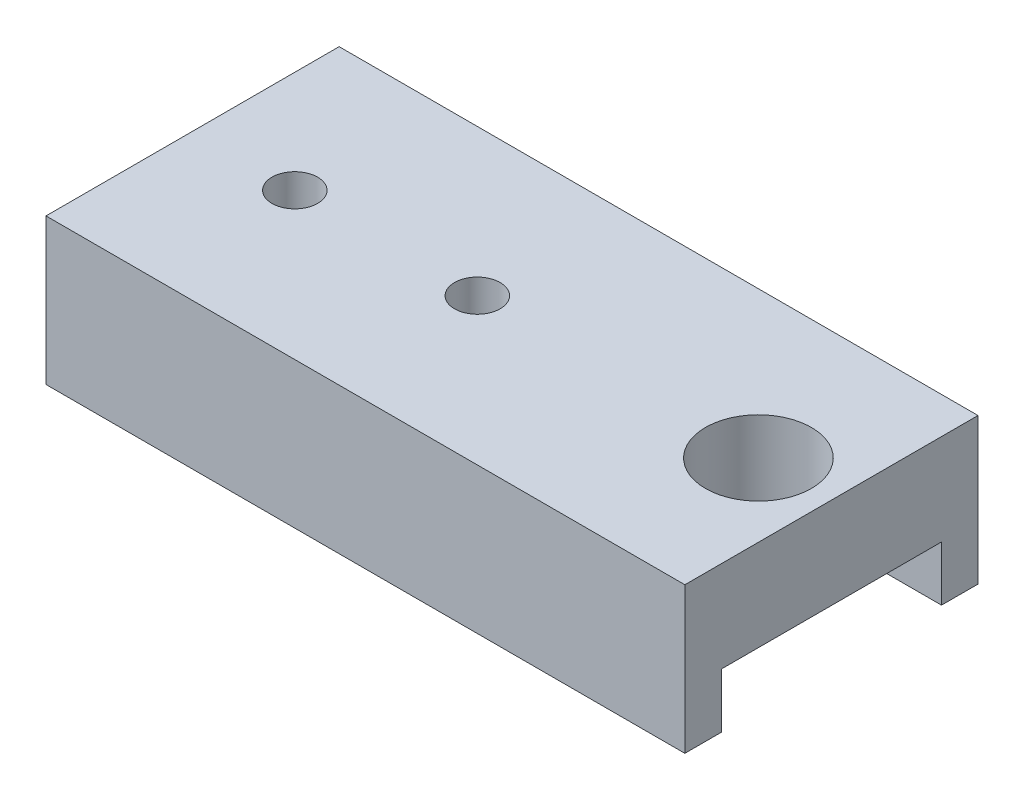
ISO-10303-21;
HEADER;
FILE_DESCRIPTION(('STEP AP214'),'2;1');
FILE_NAME('part.step','',(''),(''),'','','');
FILE_SCHEMA(('AUTOMOTIVE_DESIGN { 1 0 10303 214 1 1 1 1 }'));
ENDSEC;
DATA;
#1=APPLICATION_CONTEXT('core data for automotive mechanical design processes');
#2=APPLICATION_PROTOCOL_DEFINITION('international standard','automotive_design',2000,#1);
#3=PRODUCT_CONTEXT('',#1,'mechanical');
#4=PRODUCT('Part','Part','',(#3));
#5=PRODUCT_RELATED_PRODUCT_CATEGORY('part','',(#4));
#6=PRODUCT_DEFINITION_FORMATION('','',#4);
#7=PRODUCT_DEFINITION_CONTEXT('part definition',#1,'design');
#8=PRODUCT_DEFINITION('design','',#6,#7);
#9=PRODUCT_DEFINITION_SHAPE('','',#8);
#10=(LENGTH_UNIT() NAMED_UNIT(*) SI_UNIT(.MILLI.,.METRE.));
#11=(NAMED_UNIT(*) PLANE_ANGLE_UNIT() SI_UNIT($,.RADIAN.));
#12=(NAMED_UNIT(*) SI_UNIT($,.STERADIAN.) SOLID_ANGLE_UNIT());
#13=UNCERTAINTY_MEASURE_WITH_UNIT(LENGTH_MEASURE(1.E-05),#10,'distance_accuracy_value','');
#14=(GEOMETRIC_REPRESENTATION_CONTEXT(3) GLOBAL_UNCERTAINTY_ASSIGNED_CONTEXT((#13)) GLOBAL_UNIT_ASSIGNED_CONTEXT((#10,
#11,#12)) REPRESENTATION_CONTEXT('',''));
#15=CARTESIAN_POINT('',(0.,0.,0.));
#16=DIRECTION('',(0.,0.,1.));
#17=DIRECTION('',(1.,0.,0.));
#18=AXIS2_PLACEMENT_3D('',#15,#16,#17);
#19=CARTESIAN_POINT('',(-17.5,5.,6.03));
#20=DIRECTION('',(1.,0.,0.));
#21=DIRECTION('',(0.,0.,-1.));
#22=AXIS2_PLACEMENT_3D('',#19,#20,#21);
#23=PLANE('',#22);
#24=DIRECTION('',(0.,1.,0.));
#25=VECTOR('',#24,1.);
#26=CARTESIAN_POINT('',(-17.5,5.,8.03));
#27=LINE('',#26,#25);
#28=CARTESIAN_POINT('',(-17.5,-3.,8.03));
#29=VERTEX_POINT('',#28);
#30=CARTESIAN_POINT('',(-17.5,5.,8.03));
#31=VERTEX_POINT('',#30);
#32=EDGE_CURVE('E115',#29,#31,#27,.T.);
#33=ORIENTED_EDGE('',*,*,#32,.T.);
#34=DIRECTION('',(0.,0.,1.));
#35=VECTOR('',#34,1.);
#36=CARTESIAN_POINT('',(-17.5,5.,6.03));
#37=LINE('',#36,#35);
#38=CARTESIAN_POINT('',(-17.5,5.,-8.03));
#39=VERTEX_POINT('',#38);
#40=EDGE_CURVE('E43',#39,#31,#37,.T.);
#41=ORIENTED_EDGE('',*,*,#40,.F.);
#42=DIRECTION('',(0.,1.,0.));
#43=VECTOR('',#42,1.);
#44=CARTESIAN_POINT('',(-17.5,5.,-8.03));
#45=LINE('',#44,#43);
#46=CARTESIAN_POINT('',(-17.5,-3.,-8.03));
#47=VERTEX_POINT('',#46);
#48=EDGE_CURVE('E142',#47,#39,#45,.T.);
#49=ORIENTED_EDGE('',*,*,#48,.F.);
#50=DIRECTION('',(0.,0.,1.));
#51=VECTOR('',#50,1.);
#52=CARTESIAN_POINT('',(-17.5,-3.,-8.03));
#53=LINE('',#52,#51);
#54=CARTESIAN_POINT('',(-17.5,-3.,-6.03));
#55=VERTEX_POINT('',#54);
#56=EDGE_CURVE('E150',#47,#55,#53,.T.);
#57=ORIENTED_EDGE('',*,*,#56,.T.);
#58=DIRECTION('',(0.,1.,0.));
#59=VECTOR('',#58,1.);
#60=CARTESIAN_POINT('',(-17.5,5.,-6.03));
#61=LINE('',#60,#59);
#62=CARTESIAN_POINT('',(-17.5,0.,-6.03));
#63=VERTEX_POINT('',#62);
#64=EDGE_CURVE('E141',#55,#63,#61,.T.);
#65=ORIENTED_EDGE('',*,*,#64,.T.);
#66=DIRECTION('',(0.,0.,1.));
#67=VECTOR('',#66,1.);
#68=CARTESIAN_POINT('',(-17.5,0.,6.03));
#69=LINE('',#68,#67);
#70=CARTESIAN_POINT('',(-17.5,0.,6.03));
#71=VERTEX_POINT('',#70);
#72=EDGE_CURVE('E178',#63,#71,#69,.T.);
#73=ORIENTED_EDGE('',*,*,#72,.T.);
#74=DIRECTION('',(0.,1.,0.));
#75=VECTOR('',#74,1.);
#76=CARTESIAN_POINT('',(-17.5,5.,6.03));
#77=LINE('',#76,#75);
#78=CARTESIAN_POINT('',(-17.5,-3.,6.03));
#79=VERTEX_POINT('',#78);
#80=EDGE_CURVE('E131',#79,#71,#77,.T.);
#81=ORIENTED_EDGE('',*,*,#80,.F.);
#82=DIRECTION('',(0.,0.,-1.));
#83=VECTOR('',#82,1.);
#84=CARTESIAN_POINT('',(-17.5,-3.,8.03));
#85=LINE('',#84,#83);
#86=EDGE_CURVE('E122',#29,#79,#85,.T.);
#87=ORIENTED_EDGE('',*,*,#86,.F.);
#88=EDGE_LOOP('',(#33,#41,#49,#57,#65,#73,#81,#87));
#89=FACE_BOUND('',#88,.T.);
#90=ADVANCED_FACE('F35',(#89),#23,.F.);
#91=CARTESIAN_POINT('',(17.5,5.,6.03));
#92=DIRECTION('',(-1.,0.,0.));
#93=DIRECTION('',(0.,0.,1.));
#94=AXIS2_PLACEMENT_3D('',#91,#92,#93);
#95=PLANE('',#94);
#96=DIRECTION('',(0.,0.,-1.));
#97=VECTOR('',#96,1.);
#98=CARTESIAN_POINT('',(17.5,0.,6.03));
#99=LINE('',#98,#97);
#100=CARTESIAN_POINT('',(17.5,0.,6.03));
#101=VERTEX_POINT('',#100);
#102=CARTESIAN_POINT('',(17.5,0.,-6.03));
#103=VERTEX_POINT('',#102);
#104=EDGE_CURVE('E51',#101,#103,#99,.T.);
#105=ORIENTED_EDGE('',*,*,#104,.T.);
#106=DIRECTION('',(0.,-1.,0.));
#107=VECTOR('',#106,1.);
#108=CARTESIAN_POINT('',(17.5,5.,-6.03));
#109=LINE('',#108,#107);
#110=CARTESIAN_POINT('',(17.5,-3.,-6.03));
#111=VERTEX_POINT('',#110);
#112=EDGE_CURVE('E153',#103,#111,#109,.T.);
#113=ORIENTED_EDGE('',*,*,#112,.T.);
#114=DIRECTION('',(0.,0.,1.));
#115=VECTOR('',#114,1.);
#116=CARTESIAN_POINT('',(17.5,-3.,-8.03));
#117=LINE('',#116,#115);
#118=CARTESIAN_POINT('',(17.5,-3.,-8.03));
#119=VERTEX_POINT('',#118);
#120=EDGE_CURVE('E158',#119,#111,#117,.T.);
#121=ORIENTED_EDGE('',*,*,#120,.F.);
#122=DIRECTION('',(0.,-1.,0.));
#123=VECTOR('',#122,1.);
#124=CARTESIAN_POINT('',(17.5,5.,-8.03));
#125=LINE('',#124,#123);
#126=CARTESIAN_POINT('',(17.5,5.,-8.03));
#127=VERTEX_POINT('',#126);
#128=EDGE_CURVE('E146',#127,#119,#125,.T.);
#129=ORIENTED_EDGE('',*,*,#128,.F.);
#130=DIRECTION('',(0.,0.,-1.));
#131=VECTOR('',#130,1.);
#132=CARTESIAN_POINT('',(17.5,5.,6.03));
#133=LINE('',#132,#131);
#134=CARTESIAN_POINT('',(17.5,5.,8.03));
#135=VERTEX_POINT('',#134);
#136=EDGE_CURVE('E11',#135,#127,#133,.T.);
#137=ORIENTED_EDGE('',*,*,#136,.F.);
#138=DIRECTION('',(0.,-1.,0.));
#139=VECTOR('',#138,1.);
#140=CARTESIAN_POINT('',(17.5,5.,8.03));
#141=LINE('',#140,#139);
#142=CARTESIAN_POINT('',(17.5,-3.,8.03));
#143=VERTEX_POINT('',#142);
#144=EDGE_CURVE('E118',#135,#143,#141,.T.);
#145=ORIENTED_EDGE('',*,*,#144,.T.);
#146=DIRECTION('',(0.,0.,-1.));
#147=VECTOR('',#146,1.);
#148=CARTESIAN_POINT('',(17.5,-3.,8.03));
#149=LINE('',#148,#147);
#150=CARTESIAN_POINT('',(17.5,-3.,6.03));
#151=VERTEX_POINT('',#150);
#152=EDGE_CURVE('E137',#143,#151,#149,.T.);
#153=ORIENTED_EDGE('',*,*,#152,.T.);
#154=DIRECTION('',(0.,-1.,0.));
#155=VECTOR('',#154,1.);
#156=CARTESIAN_POINT('',(17.5,5.,6.03));
#157=LINE('',#156,#155);
#158=EDGE_CURVE('E125',#101,#151,#157,.T.);
#159=ORIENTED_EDGE('',*,*,#158,.F.);
#160=EDGE_LOOP('',(#105,#113,#121,#129,#137,#145,#153,#159));
#161=FACE_BOUND('',#160,.T.);
#162=ADVANCED_FACE('F192',(#161),#95,.F.);
#163=CARTESIAN_POINT('',(0.,5.,0.));
#164=DIRECTION('',(0.,1.,0.));
#165=DIRECTION('',(0.,0.,1.));
#166=AXIS2_PLACEMENT_3D('',#163,#164,#165);
#167=PLANE('',#166);
#168=ORIENTED_EDGE('',*,*,#136,.T.);
#169=DIRECTION('',(1.,0.,0.));
#170=VECTOR('',#169,1.);
#171=CARTESIAN_POINT('',(-17.5,5.,-8.03));
#172=LINE('',#171,#170);
#173=EDGE_CURVE('E106',#39,#127,#172,.T.);
#174=ORIENTED_EDGE('',*,*,#173,.F.);
#175=ORIENTED_EDGE('',*,*,#40,.T.);
#176=DIRECTION('',(1.,0.,0.));
#177=VECTOR('',#176,1.);
#178=CARTESIAN_POINT('',(-17.5,5.,8.03));
#179=LINE('',#178,#177);
#180=EDGE_CURVE('E103',#31,#135,#179,.T.);
#181=ORIENTED_EDGE('',*,*,#180,.T.);
#182=EDGE_LOOP('',(#168,#174,#175,#181));
#183=FACE_BOUND('',#182,.T.);
#184=CARTESIAN_POINT('',(-1.9,5.,0.));
#185=DIRECTION('',(0.,1.,0.));
#186=DIRECTION('',(0.,0.,1.));
#187=AXIS2_PLACEMENT_3D('',#184,#185,#186);
#188=CIRCLE('',#187,1.25);
#189=CARTESIAN_POINT('',(-1.9,5.,1.25));
#190=VERTEX_POINT('',#189);
#191=EDGE_CURVE('E161',#190,#190,#188,.T.);
#192=ORIENTED_EDGE('',*,*,#191,.F.);
#193=EDGE_LOOP('',(#192));
#194=FACE_BOUND('',#193,.T.);
#195=CARTESIAN_POINT('',(-11.9,5.,0.));
#196=DIRECTION('',(0.,1.,0.));
#197=DIRECTION('',(0.,0.,1.));
#198=AXIS2_PLACEMENT_3D('',#195,#196,#197);
#199=CIRCLE('',#198,1.25);
#200=CARTESIAN_POINT('',(-11.9,5.,1.25));
#201=VERTEX_POINT('',#200);
#202=EDGE_CURVE('E167',#201,#201,#199,.T.);
#203=ORIENTED_EDGE('',*,*,#202,.F.);
#204=EDGE_LOOP('',(#203));
#205=FACE_BOUND('',#204,.T.);
#206=CARTESIAN_POINT('',(13.5,5.,0.));
#207=DIRECTION('',(0.,1.,0.));
#208=DIRECTION('',(0.,0.,1.));
#209=AXIS2_PLACEMENT_3D('',#206,#207,#208);
#210=CIRCLE('',#209,2.9);
#211=CARTESIAN_POINT('',(13.5,5.,2.9));
#212=VERTEX_POINT('',#211);
#213=EDGE_CURVE('E173',#212,#212,#210,.T.);
#214=ORIENTED_EDGE('',*,*,#213,.F.);
#215=EDGE_LOOP('',(#214));
#216=FACE_BOUND('',#215,.T.);
#217=ADVANCED_FACE('F101',(#183,#194,#205,#216),#167,.T.);
#218=CARTESIAN_POINT('',(0.,0.,0.));
#219=DIRECTION('',(0.,1.,0.));
#220=DIRECTION('',(0.,0.,1.));
#221=AXIS2_PLACEMENT_3D('',#218,#219,#220);
#222=PLANE('',#221);
#223=CARTESIAN_POINT('',(-1.9,0.,0.));
#224=DIRECTION('',(0.,1.,0.));
#225=DIRECTION('',(0.,0.,1.));
#226=AXIS2_PLACEMENT_3D('',#223,#224,#225);
#227=CIRCLE('',#226,1.25);
#228=CARTESIAN_POINT('',(-1.9,0.,1.25));
#229=VERTEX_POINT('',#228);
#230=EDGE_CURVE('E164',#229,#229,#227,.T.);
#231=ORIENTED_EDGE('',*,*,#230,.T.);
#232=EDGE_LOOP('',(#231));
#233=FACE_BOUND('',#232,.T.);
#234=CARTESIAN_POINT('',(-11.9,0.,0.));
#235=DIRECTION('',(0.,1.,0.));
#236=DIRECTION('',(0.,0.,1.));
#237=AXIS2_PLACEMENT_3D('',#234,#235,#236);
#238=CIRCLE('',#237,1.25);
#239=CARTESIAN_POINT('',(-11.9,0.,1.25));
#240=VERTEX_POINT('',#239);
#241=EDGE_CURVE('E170',#240,#240,#238,.T.);
#242=ORIENTED_EDGE('',*,*,#241,.T.);
#243=EDGE_LOOP('',(#242));
#244=FACE_BOUND('',#243,.T.);
#245=CARTESIAN_POINT('',(13.5,0.,0.));
#246=DIRECTION('',(0.,1.,0.));
#247=DIRECTION('',(0.,0.,1.));
#248=AXIS2_PLACEMENT_3D('',#245,#246,#247);
#249=CIRCLE('',#248,2.9);
#250=CARTESIAN_POINT('',(13.5,0.,2.9));
#251=VERTEX_POINT('',#250);
#252=EDGE_CURVE('E176',#251,#251,#249,.T.);
#253=ORIENTED_EDGE('',*,*,#252,.T.);
#254=EDGE_LOOP('',(#253));
#255=FACE_BOUND('',#254,.T.);
#256=ORIENTED_EDGE('',*,*,#72,.F.);
#257=DIRECTION('',(-1.,0.,0.));
#258=VECTOR('',#257,1.);
#259=CARTESIAN_POINT('',(17.5,0.,-6.03));
#260=LINE('',#259,#258);
#261=EDGE_CURVE('E38',#103,#63,#260,.T.);
#262=ORIENTED_EDGE('',*,*,#261,.F.);
#263=ORIENTED_EDGE('',*,*,#104,.F.);
#264=DIRECTION('',(-1.,0.,0.));
#265=VECTOR('',#264,1.);
#266=CARTESIAN_POINT('',(17.5,0.,6.03));
#267=LINE('',#266,#265);
#268=EDGE_CURVE('E58',#101,#71,#267,.T.);
#269=ORIENTED_EDGE('',*,*,#268,.T.);
#270=EDGE_LOOP('',(#256,#262,#263,#269));
#271=FACE_BOUND('',#270,.T.);
#272=ADVANCED_FACE('F213',(#233,#244,#255,#271),#222,.F.);
#273=CARTESIAN_POINT('',(13.5,5.,0.));
#274=DIRECTION('',(0.,1.,0.));
#275=DIRECTION('',(0.,0.,1.));
#276=AXIS2_PLACEMENT_3D('',#273,#274,#275);
#277=CYLINDRICAL_SURFACE('',#276,2.9);
#278=ORIENTED_EDGE('',*,*,#252,.F.);
#279=EDGE_LOOP('',(#278));
#280=FACE_BOUND('',#279,.T.);
#281=ORIENTED_EDGE('',*,*,#213,.T.);
#282=EDGE_LOOP('',(#281));
#283=FACE_BOUND('',#282,.T.);
#284=ADVANCED_FACE('F217',(#280,#283),#277,.F.);
#285=CARTESIAN_POINT('',(-11.9,5.,0.));
#286=DIRECTION('',(0.,1.,0.));
#287=DIRECTION('',(0.,0.,1.));
#288=AXIS2_PLACEMENT_3D('',#285,#286,#287);
#289=CYLINDRICAL_SURFACE('',#288,1.25);
#290=ORIENTED_EDGE('',*,*,#241,.F.);
#291=EDGE_LOOP('',(#290));
#292=FACE_BOUND('',#291,.T.);
#293=ORIENTED_EDGE('',*,*,#202,.T.);
#294=EDGE_LOOP('',(#293));
#295=FACE_BOUND('',#294,.T.);
#296=ADVANCED_FACE('F222',(#292,#295),#289,.F.);
#297=CARTESIAN_POINT('',(-1.9,5.,0.));
#298=DIRECTION('',(0.,1.,0.));
#299=DIRECTION('',(0.,0.,1.));
#300=AXIS2_PLACEMENT_3D('',#297,#298,#299);
#301=CYLINDRICAL_SURFACE('',#300,1.25);
#302=ORIENTED_EDGE('',*,*,#230,.F.);
#303=EDGE_LOOP('',(#302));
#304=FACE_BOUND('',#303,.T.);
#305=ORIENTED_EDGE('',*,*,#191,.T.);
#306=EDGE_LOOP('',(#305));
#307=FACE_BOUND('',#306,.T.);
#308=ADVANCED_FACE('F203',(#304,#307),#301,.F.);
#309=CARTESIAN_POINT('',(-17.5,-3.,-8.03));
#310=DIRECTION('',(0.,1.,0.));
#311=DIRECTION('',(-1.,0.,0.));
#312=AXIS2_PLACEMENT_3D('',#309,#310,#311);
#313=PLANE('',#312);
#314=DIRECTION('',(-1.,0.,0.));
#315=VECTOR('',#314,1.);
#316=CARTESIAN_POINT('',(-17.5,-3.,-6.03));
#317=LINE('',#316,#315);
#318=EDGE_CURVE('E144',#111,#55,#317,.T.);
#319=ORIENTED_EDGE('',*,*,#318,.T.);
#320=ORIENTED_EDGE('',*,*,#56,.F.);
#321=DIRECTION('',(-1.,0.,0.));
#322=VECTOR('',#321,1.);
#323=CARTESIAN_POINT('',(-17.5,-3.,-8.03));
#324=LINE('',#323,#322);
#325=EDGE_CURVE('E148',#119,#47,#324,.T.);
#326=ORIENTED_EDGE('',*,*,#325,.F.);
#327=ORIENTED_EDGE('',*,*,#120,.T.);
#328=EDGE_LOOP('',(#319,#320,#326,#327));
#329=FACE_BOUND('',#328,.T.);
#330=ADVANCED_FACE('F189',(#329),#313,.F.);
#331=CARTESIAN_POINT('',(0.,0.,-8.03));
#332=DIRECTION('',(0.,0.,1.));
#333=DIRECTION('',(1.,0.,0.));
#334=AXIS2_PLACEMENT_3D('',#331,#332,#333);
#335=PLANE('',#334);
#336=ORIENTED_EDGE('',*,*,#48,.T.);
#337=ORIENTED_EDGE('',*,*,#173,.T.);
#338=ORIENTED_EDGE('',*,*,#128,.T.);
#339=ORIENTED_EDGE('',*,*,#325,.T.);
#340=EDGE_LOOP('',(#336,#337,#338,#339));
#341=FACE_BOUND('',#340,.T.);
#342=ADVANCED_FACE('F194',(#341),#335,.F.);
#343=CARTESIAN_POINT('',(0.,0.,-6.03));
#344=DIRECTION('',(0.,0.,1.));
#345=DIRECTION('',(1.,0.,0.));
#346=AXIS2_PLACEMENT_3D('',#343,#344,#345);
#347=PLANE('',#346);
#348=ORIENTED_EDGE('',*,*,#112,.F.);
#349=ORIENTED_EDGE('',*,*,#261,.T.);
#350=ORIENTED_EDGE('',*,*,#64,.F.);
#351=ORIENTED_EDGE('',*,*,#318,.F.);
#352=EDGE_LOOP('',(#348,#349,#350,#351));
#353=FACE_BOUND('',#352,.T.);
#354=ADVANCED_FACE('F184',(#353),#347,.T.);
#355=CARTESIAN_POINT('',(-17.5,-3.,8.03));
#356=DIRECTION('',(0.,1.,0.));
#357=DIRECTION('',(-1.,0.,0.));
#358=AXIS2_PLACEMENT_3D('',#355,#356,#357);
#359=PLANE('',#358);
#360=DIRECTION('',(-1.,0.,0.));
#361=VECTOR('',#360,1.);
#362=CARTESIAN_POINT('',(-17.5,-3.,6.03));
#363=LINE('',#362,#361);
#364=EDGE_CURVE('E123',#151,#79,#363,.T.);
#365=ORIENTED_EDGE('',*,*,#364,.F.);
#366=ORIENTED_EDGE('',*,*,#152,.F.);
#367=DIRECTION('',(-1.,0.,0.));
#368=VECTOR('',#367,1.);
#369=CARTESIAN_POINT('',(-17.5,-3.,8.03));
#370=LINE('',#369,#368);
#371=EDGE_CURVE('E129',#143,#29,#370,.T.);
#372=ORIENTED_EDGE('',*,*,#371,.T.);
#373=ORIENTED_EDGE('',*,*,#86,.T.);
#374=EDGE_LOOP('',(#365,#366,#372,#373));
#375=FACE_BOUND('',#374,.T.);
#376=ADVANCED_FACE('F201',(#375),#359,.F.);
#377=CARTESIAN_POINT('',(0.,0.,8.03));
#378=DIRECTION('',(0.,0.,-1.));
#379=DIRECTION('',(1.,0.,0.));
#380=AXIS2_PLACEMENT_3D('',#377,#378,#379);
#381=PLANE('',#380);
#382=ORIENTED_EDGE('',*,*,#32,.F.);
#383=ORIENTED_EDGE('',*,*,#371,.F.);
#384=ORIENTED_EDGE('',*,*,#144,.F.);
#385=ORIENTED_EDGE('',*,*,#180,.F.);
#386=EDGE_LOOP('',(#382,#383,#384,#385));
#387=FACE_BOUND('',#386,.T.);
#388=ADVANCED_FACE('F114',(#387),#381,.F.);
#389=CARTESIAN_POINT('',(0.,0.,6.03));
#390=DIRECTION('',(0.,0.,-1.));
#391=DIRECTION('',(1.,0.,0.));
#392=AXIS2_PLACEMENT_3D('',#389,#390,#391);
#393=PLANE('',#392);
#394=ORIENTED_EDGE('',*,*,#158,.T.);
#395=ORIENTED_EDGE('',*,*,#364,.T.);
#396=ORIENTED_EDGE('',*,*,#80,.T.);
#397=ORIENTED_EDGE('',*,*,#268,.F.);
#398=EDGE_LOOP('',(#394,#395,#396,#397));
#399=FACE_BOUND('',#398,.T.);
#400=ADVANCED_FACE('F314',(#399),#393,.T.);
#401=CLOSED_SHELL('',(#90,#162,#217,#272,#284,#296,#308,#330,#342,#354,#376,#388,#400));
#402=MANIFOLD_SOLID_BREP('B2',#401);
#403=ADVANCED_BREP_SHAPE_REPRESENTATION('',(#18,#402),#14);
#404=SHAPE_DEFINITION_REPRESENTATION(#9,#403);
ENDSEC;
END-ISO-10303-21;
